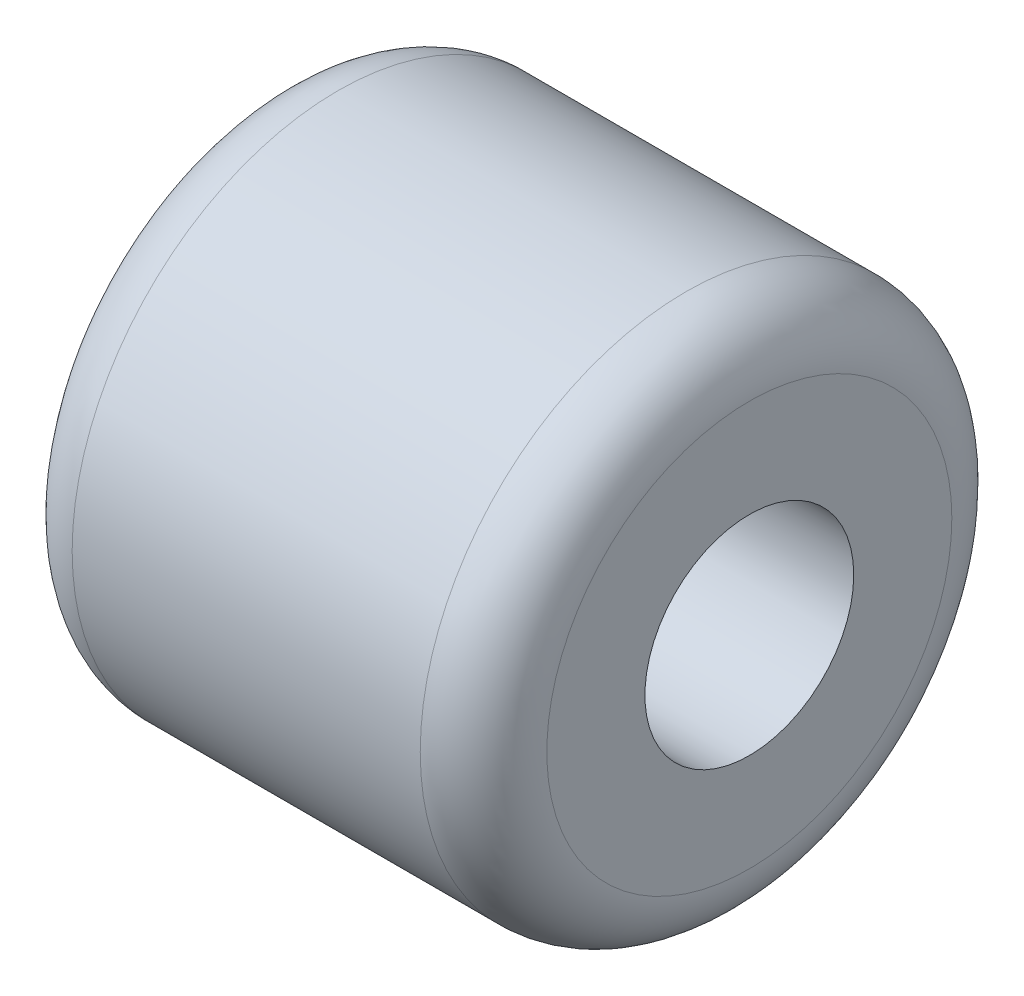
ISO-10303-21;
HEADER;
FILE_DESCRIPTION(('STEP AP214'),'2;1');
FILE_NAME('part.step','',(''),(''),'','','');
FILE_SCHEMA(('AUTOMOTIVE_DESIGN { 1 0 10303 214 1 1 1 1 }'));
ENDSEC;
DATA;
#1=APPLICATION_CONTEXT('core data for automotive mechanical design processes');
#2=APPLICATION_PROTOCOL_DEFINITION('international standard','automotive_design',2000,#1);
#3=PRODUCT_CONTEXT('',#1,'mechanical');
#4=PRODUCT('Part','Part','',(#3));
#5=PRODUCT_RELATED_PRODUCT_CATEGORY('part','',(#4));
#6=PRODUCT_DEFINITION_FORMATION('','',#4);
#7=PRODUCT_DEFINITION_CONTEXT('part definition',#1,'design');
#8=PRODUCT_DEFINITION('design','',#6,#7);
#9=PRODUCT_DEFINITION_SHAPE('','',#8);
#10=(LENGTH_UNIT() NAMED_UNIT(*) SI_UNIT(.MILLI.,.METRE.));
#11=(NAMED_UNIT(*) PLANE_ANGLE_UNIT() SI_UNIT($,.RADIAN.));
#12=(NAMED_UNIT(*) SI_UNIT($,.STERADIAN.) SOLID_ANGLE_UNIT());
#13=UNCERTAINTY_MEASURE_WITH_UNIT(LENGTH_MEASURE(1.E-05),#10,'distance_accuracy_value','');
#14=(GEOMETRIC_REPRESENTATION_CONTEXT(3) GLOBAL_UNCERTAINTY_ASSIGNED_CONTEXT((#13)) GLOBAL_UNIT_ASSIGNED_CONTEXT((#10,
#11,#12)) REPRESENTATION_CONTEXT('',''));
#15=CARTESIAN_POINT('',(0.,0.,0.));
#16=DIRECTION('',(0.,0.,1.));
#17=DIRECTION('',(1.,0.,0.));
#18=AXIS2_PLACEMENT_3D('',#15,#16,#17);
#19=CARTESIAN_POINT('',(7.5,0.,0.));
#20=DIRECTION('',(-1.,0.,0.));
#21=DIRECTION('',(0.,0.,1.));
#22=AXIS2_PLACEMENT_3D('',#19,#20,#21);
#23=CYLINDRICAL_SURFACE('',#22,8.4);
#24=CARTESIAN_POINT('',(-5.5,0.,0.));
#25=DIRECTION('',(1.,0.,0.));
#26=DIRECTION('',(0.,0.,-1.));
#27=AXIS2_PLACEMENT_3D('',#24,#25,#26);
#28=CIRCLE('',#27,8.4);
#29=CARTESIAN_POINT('',(-5.5,0.,-8.4));
#30=VERTEX_POINT('',#29);
#31=EDGE_CURVE('E57',#30,#30,#28,.T.);
#32=ORIENTED_EDGE('',*,*,#31,.T.);
#33=EDGE_LOOP('',(#32));
#34=FACE_BOUND('',#33,.T.);
#35=CARTESIAN_POINT('',(5.5,0.,0.));
#36=DIRECTION('',(1.,0.,0.));
#37=DIRECTION('',(0.,0.,-1.));
#38=AXIS2_PLACEMENT_3D('',#35,#36,#37);
#39=CIRCLE('',#38,8.4);
#40=CARTESIAN_POINT('',(5.5,0.,-8.4));
#41=VERTEX_POINT('',#40);
#42=EDGE_CURVE('E63',#41,#41,#39,.F.);
#43=ORIENTED_EDGE('',*,*,#42,.T.);
#44=EDGE_LOOP('',(#43));
#45=FACE_BOUND('',#44,.T.);
#46=ADVANCED_FACE('F43',(#34,#45),#23,.T.);
#47=CARTESIAN_POINT('',(7.5,0.,0.));
#48=DIRECTION('',(1.,0.,0.));
#49=DIRECTION('',(0.,0.,-1.));
#50=AXIS2_PLACEMENT_3D('',#47,#48,#49);
#51=PLANE('',#50);
#52=CARTESIAN_POINT('',(7.5,0.,0.));
#53=DIRECTION('',(1.,0.,0.));
#54=DIRECTION('',(0.,0.,-1.));
#55=AXIS2_PLACEMENT_3D('',#52,#53,#54);
#56=CIRCLE('',#55,6.4);
#57=CARTESIAN_POINT('',(7.5,0.,-6.4));
#58=VERTEX_POINT('',#57);
#59=EDGE_CURVE('E10',#58,#58,#56,.T.);
#60=ORIENTED_EDGE('',*,*,#59,.T.);
#61=EDGE_LOOP('',(#60));
#62=FACE_BOUND('',#61,.T.);
#63=CARTESIAN_POINT('',(7.5,0.,0.));
#64=DIRECTION('',(1.,0.,0.));
#65=DIRECTION('',(0.,0.,-1.));
#66=AXIS2_PLACEMENT_3D('',#63,#64,#65);
#67=CIRCLE('',#66,3.3);
#68=CARTESIAN_POINT('',(7.5,0.,-3.3));
#69=VERTEX_POINT('',#68);
#70=EDGE_CURVE('E70',#69,#69,#67,.T.);
#71=ORIENTED_EDGE('',*,*,#70,.F.);
#72=EDGE_LOOP('',(#71));
#73=FACE_BOUND('',#72,.T.);
#74=ADVANCED_FACE('F83',(#62,#73),#51,.T.);
#75=CARTESIAN_POINT('',(-7.5,0.,0.));
#76=DIRECTION('',(1.,0.,0.));
#77=DIRECTION('',(0.,0.,-1.));
#78=AXIS2_PLACEMENT_3D('',#75,#76,#77);
#79=PLANE('',#78);
#80=CARTESIAN_POINT('',(-7.5,0.,0.));
#81=DIRECTION('',(1.,0.,0.));
#82=DIRECTION('',(0.,0.,-1.));
#83=AXIS2_PLACEMENT_3D('',#80,#81,#82);
#84=CIRCLE('',#83,6.4);
#85=CARTESIAN_POINT('',(-7.5,0.,-6.4));
#86=VERTEX_POINT('',#85);
#87=EDGE_CURVE('E51',#86,#86,#84,.F.);
#88=ORIENTED_EDGE('',*,*,#87,.T.);
#89=EDGE_LOOP('',(#88));
#90=FACE_BOUND('',#89,.T.);
#91=CARTESIAN_POINT('',(-7.5,0.,0.));
#92=DIRECTION('',(1.,0.,0.));
#93=DIRECTION('',(0.,0.,-1.));
#94=AXIS2_PLACEMENT_3D('',#91,#92,#93);
#95=CIRCLE('',#94,3.3);
#96=CARTESIAN_POINT('',(-7.5,0.,-3.3));
#97=VERTEX_POINT('',#96);
#98=EDGE_CURVE('E69',#97,#97,#95,.T.);
#99=ORIENTED_EDGE('',*,*,#98,.T.);
#100=EDGE_LOOP('',(#99));
#101=FACE_BOUND('',#100,.T.);
#102=ADVANCED_FACE('F78',(#90,#101),#79,.F.);
#103=CARTESIAN_POINT('',(-7.5,0.,0.));
#104=DIRECTION('',(1.,0.,0.));
#105=DIRECTION('',(0.,0.,-1.));
#106=AXIS2_PLACEMENT_3D('',#103,#104,#105);
#107=CYLINDRICAL_SURFACE('',#106,3.3);
#108=ORIENTED_EDGE('',*,*,#98,.F.);
#109=EDGE_LOOP('',(#108));
#110=FACE_BOUND('',#109,.T.);
#111=ORIENTED_EDGE('',*,*,#70,.T.);
#112=EDGE_LOOP('',(#111));
#113=FACE_BOUND('',#112,.T.);
#114=ADVANCED_FACE('F76',(#110,#113),#107,.F.);
#115=CARTESIAN_POINT('',(-5.5,0.,0.));
#116=DIRECTION('',(1.,0.,0.));
#117=DIRECTION('',(0.,0.,-1.));
#118=AXIS2_PLACEMENT_3D('',#115,#116,#117);
#119=TOROIDAL_SURFACE('',#118,6.4,2.);
#120=ORIENTED_EDGE('',*,*,#87,.F.);
#121=EDGE_LOOP('',(#120));
#122=FACE_BOUND('',#121,.T.);
#123=ORIENTED_EDGE('',*,*,#31,.F.);
#124=EDGE_LOOP('',(#123));
#125=FACE_BOUND('',#124,.T.);
#126=ADVANCED_FACE('F82',(#122,#125),#119,.T.);
#127=CARTESIAN_POINT('',(5.5,0.,0.));
#128=DIRECTION('',(1.,0.,0.));
#129=DIRECTION('',(0.,0.,-1.));
#130=AXIS2_PLACEMENT_3D('',#127,#128,#129);
#131=TOROIDAL_SURFACE('',#130,6.4,2.);
#132=ORIENTED_EDGE('',*,*,#42,.F.);
#133=EDGE_LOOP('',(#132));
#134=FACE_BOUND('',#133,.T.);
#135=ORIENTED_EDGE('',*,*,#59,.F.);
#136=EDGE_LOOP('',(#135));
#137=FACE_BOUND('',#136,.T.);
#138=ADVANCED_FACE('F44',(#134,#137),#131,.T.);
#139=CLOSED_SHELL('',(#46,#74,#102,#114,#126,#138));
#140=MANIFOLD_SOLID_BREP('B2',#139);
#141=ADVANCED_BREP_SHAPE_REPRESENTATION('',(#18,#140),#14);
#142=SHAPE_DEFINITION_REPRESENTATION(#9,#141);
ENDSEC;
END-ISO-10303-21;
